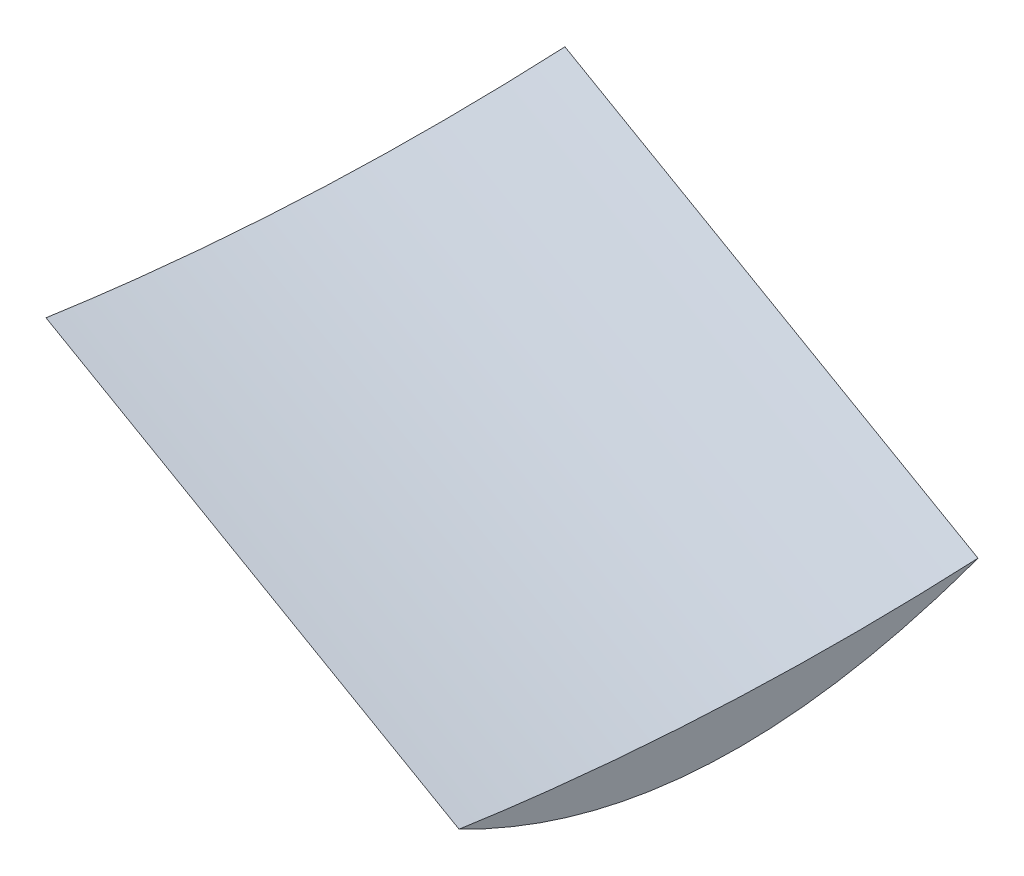
ISO-10303-21;
HEADER;
FILE_DESCRIPTION(('STEP AP214'),'2;1');
FILE_NAME('part.step','',(''),(''),'','','');
FILE_SCHEMA(('AUTOMOTIVE_DESIGN { 1 0 10303 214 1 1 1 1 }'));
ENDSEC;
DATA;
#1=APPLICATION_CONTEXT('core data for automotive mechanical design processes');
#2=APPLICATION_PROTOCOL_DEFINITION('international standard','automotive_design',2000,#1);
#3=PRODUCT_CONTEXT('',#1,'mechanical');
#4=PRODUCT('Part','Part','',(#3));
#5=PRODUCT_RELATED_PRODUCT_CATEGORY('part','',(#4));
#6=PRODUCT_DEFINITION_FORMATION('','',#4);
#7=PRODUCT_DEFINITION_CONTEXT('part definition',#1,'design');
#8=PRODUCT_DEFINITION('design','',#6,#7);
#9=PRODUCT_DEFINITION_SHAPE('','',#8);
#10=(LENGTH_UNIT() NAMED_UNIT(*) SI_UNIT(.MILLI.,.METRE.));
#11=(NAMED_UNIT(*) PLANE_ANGLE_UNIT() SI_UNIT($,.RADIAN.));
#12=(NAMED_UNIT(*) SI_UNIT($,.STERADIAN.) SOLID_ANGLE_UNIT());
#13=UNCERTAINTY_MEASURE_WITH_UNIT(LENGTH_MEASURE(1.E-05),#10,'distance_accuracy_value','');
#14=(GEOMETRIC_REPRESENTATION_CONTEXT(3) GLOBAL_UNCERTAINTY_ASSIGNED_CONTEXT((#13)) GLOBAL_UNIT_ASSIGNED_CONTEXT((#10,
#11,#12)) REPRESENTATION_CONTEXT('',''));
#15=CARTESIAN_POINT('',(0.,0.,0.));
#16=DIRECTION('',(0.,0.,1.));
#17=DIRECTION('',(1.,0.,0.));
#18=AXIS2_PLACEMENT_3D('',#15,#16,#17);
#19=CARTESIAN_POINT('',(0.,-45.2467627871021,-200.725973618223));
#20=DIRECTION('',(-1.,0.,0.));
#21=DIRECTION('',(0.,0.,1.));
#22=AXIS2_PLACEMENT_3D('',#19,#20,#21);
#23=PLANE('',#22);
#24=CARTESIAN_POINT('',(0.,21.7249035442321,44.991742266569));
#25=CARTESIAN_POINT('',(0.,-100.101611133958,-192.732864503506));
#26=CARTESIAN_POINT('',(0.,-2.50873242472436,-462.429907732447));
#27=B_SPLINE_CURVE_WITH_KNOTS('',2,(#24,#25,#26),.UNSPECIFIED.,.F.,.F.,(3,3),(0.,1.),.UNSPECIFIED.);
#28=CARTESIAN_POINT('',(0.,21.7249035442321,44.991742266569));
#29=VERTEX_POINT('',#28);
#30=CARTESIAN_POINT('',(0.,-2.50873242472436,-462.429907732447));
#31=VERTEX_POINT('',#30);
#32=EDGE_CURVE('E61',#29,#31,#27,.T.);
#33=ORIENTED_EDGE('',*,*,#32,.T.);
#34=CARTESIAN_POINT('',(0.,-2.50873242472436,-462.429907732447));
#35=CARTESIAN_POINT('',(0.,-14.7483963263263,-207.26584403443));
#36=CARTESIAN_POINT('',(0.,21.7249035442321,44.991742266569));
#37=B_SPLINE_CURVE_WITH_KNOTS('',2,(#34,#35,#36),.UNSPECIFIED.,.F.,.F.,(3,3),(0.,1.),.UNSPECIFIED.);
#38=EDGE_CURVE('E66',#31,#29,#37,.T.);
#39=ORIENTED_EDGE('',*,*,#38,.T.);
#40=EDGE_LOOP('',(#33,#39));
#41=FACE_BOUND('',#40,.T.);
#42=ADVANCED_FACE('F33',(#41),#23,.F.);
#43=CARTESIAN_POINT('',(-635.,-45.2467627871021,-431.847072377269));
#44=DIRECTION('',(-1.,0.,0.));
#45=DIRECTION('',(0.,0.,1.));
#46=AXIS2_PLACEMENT_3D('',#43,#44,#45);
#47=PLANE('',#46);
#48=CARTESIAN_POINT('',(-635.,21.7249035442321,-186.129356492477));
#49=CARTESIAN_POINT('',(-635.,-100.101611133958,-423.853963262553));
#50=CARTESIAN_POINT('',(-635.,-2.50873242472436,-693.551006491493));
#51=B_SPLINE_CURVE_WITH_KNOTS('',2,(#48,#49,#50),.UNSPECIFIED.,.F.,.F.,(3,3),(0.,1.),.UNSPECIFIED.);
#52=CARTESIAN_POINT('',(-635.,21.7249035442321,-186.129356492477));
#53=VERTEX_POINT('',#52);
#54=CARTESIAN_POINT('',(-635.,-2.50873242472436,-693.551006491493));
#55=VERTEX_POINT('',#54);
#56=EDGE_CURVE('E49',#53,#55,#51,.T.);
#57=ORIENTED_EDGE('',*,*,#56,.F.);
#58=CARTESIAN_POINT('',(-635.,-2.50873242472436,-693.551006491493));
#59=CARTESIAN_POINT('',(-635.,-14.7483963263263,-438.386942793476));
#60=CARTESIAN_POINT('',(-635.,21.7249035442321,-186.129356492477));
#61=B_SPLINE_CURVE_WITH_KNOTS('',2,(#58,#59,#60),.UNSPECIFIED.,.F.,.F.,(3,3),(0.,1.),.UNSPECIFIED.);
#62=EDGE_CURVE('E11',#55,#53,#61,.T.);
#63=ORIENTED_EDGE('',*,*,#62,.F.);
#64=EDGE_LOOP('',(#57,#63));
#65=FACE_BOUND('',#64,.T.);
#66=ADVANCED_FACE('F92',(#65),#47,.T.);
#67=CARTESIAN_POINT('',(0.,21.7249035442321,44.991742266569));
#68=CARTESIAN_POINT('',(-635.,21.7249035442321,-186.129356492477));
#69=CARTESIAN_POINT('',(0.,-100.101611133958,-192.732864503506));
#70=CARTESIAN_POINT('',(-635.,-100.101611133958,-423.853963262553));
#71=CARTESIAN_POINT('',(0.,-2.50873242472436,-462.429907732447));
#72=CARTESIAN_POINT('',(-635.,-2.50873242472436,-693.551006491494));
#73=B_SPLINE_SURFACE_WITH_KNOTS('',2,1,((#67,#68),(#69,#70),(#71,#72)),.UNSPECIFIED.,.F.,.F.,
.F.,(3,3),(2,2),(0.,1.),(0.,1.),.UNSPECIFIED.);
#74=DIRECTION('',(-0.939692620785905,0.,-0.342020143325679));
#75=VECTOR('',#74,1.);
#76=CARTESIAN_POINT('',(0.,-2.50873242472436,-462.429907732447));
#77=LINE('',#76,#75);
#78=EDGE_CURVE('E42',#31,#55,#77,.T.);
#79=DIRECTION('',(-0.939692620785905,0.,-0.342020143325679));
#80=VECTOR('',#79,1.);
#81=CARTESIAN_POINT('',(0.,21.7249035442321,44.991742266569));
#82=LINE('',#81,#80);
#83=EDGE_CURVE('E64',#29,#53,#82,.T.);
#84=ORIENTED_EDGE('',*,*,#78,.F.);
#85=ORIENTED_EDGE('',*,*,#32,.F.);
#86=ORIENTED_EDGE('',*,*,#83,.T.);
#87=ORIENTED_EDGE('',*,*,#56,.T.);
#88=EDGE_LOOP('',(#84,#85,#86,#87));
#89=FACE_BOUND('',#88,.T.);
#90=ADVANCED_FACE('F63',(#89),#73,.F.);
#91=CARTESIAN_POINT('',(0.,-2.50873242472436,-462.429907732447));
#92=CARTESIAN_POINT('',(-635.,-2.50873242472436,-693.551006491494));
#93=CARTESIAN_POINT('',(0.,-14.7483963263263,-207.26584403443));
#94=CARTESIAN_POINT('',(-635.,-14.7483963263263,-438.386942793476));
#95=CARTESIAN_POINT('',(0.,21.7249035442321,44.991742266569));
#96=CARTESIAN_POINT('',(-635.,21.7249035442321,-186.129356492477));
#97=B_SPLINE_SURFACE_WITH_KNOTS('',2,1,((#91,#92),(#93,#94),(#95,#96)),.UNSPECIFIED.,.F.,.F.,
.F.,(3,3),(2,2),(0.,1.),(0.,1.),.UNSPECIFIED.);
#98=ORIENTED_EDGE('',*,*,#62,.T.);
#99=ORIENTED_EDGE('',*,*,#83,.F.);
#100=ORIENTED_EDGE('',*,*,#38,.F.);
#101=ORIENTED_EDGE('',*,*,#78,.T.);
#102=EDGE_LOOP('',(#98,#99,#100,#101));
#103=FACE_BOUND('',#102,.T.);
#104=ADVANCED_FACE('F68',(#103),#97,.F.);
#105=CLOSED_SHELL('',(#42,#66,#90,#104));
#106=MANIFOLD_SOLID_BREP('B2',#105);
#107=ADVANCED_BREP_SHAPE_REPRESENTATION('',(#18,#106),#14);
#108=SHAPE_DEFINITION_REPRESENTATION(#9,#107);
ENDSEC;
END-ISO-10303-21;
